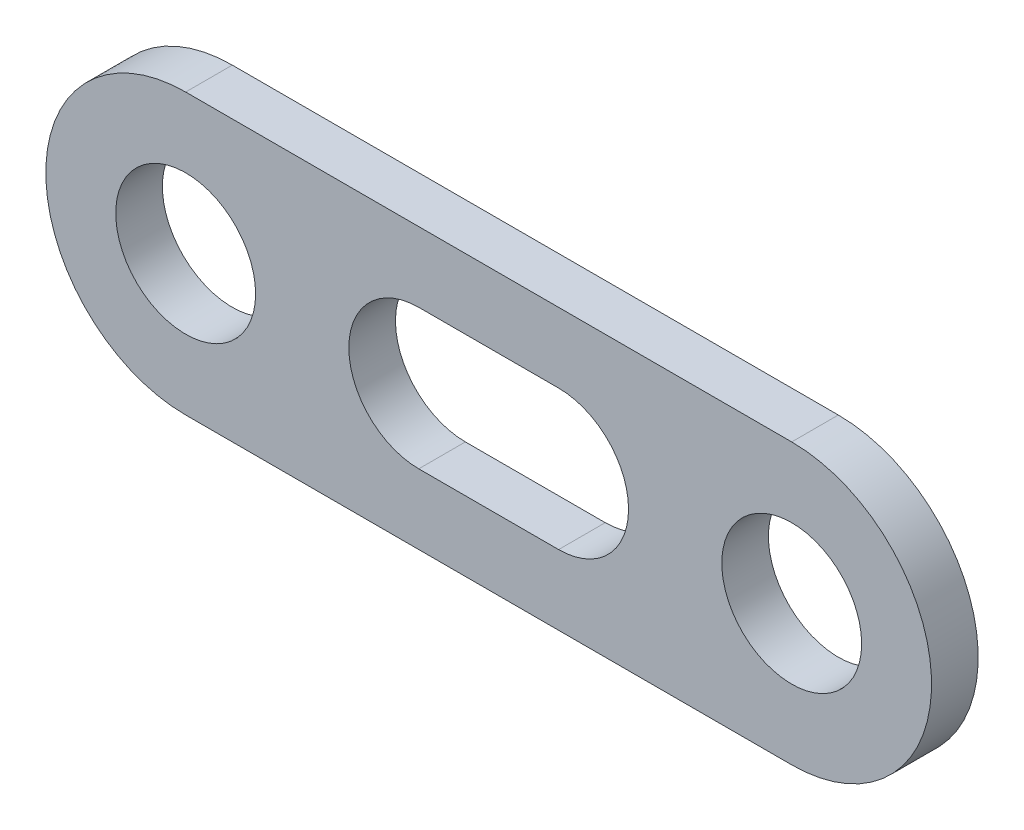
ISO-10303-21;
HEADER;
FILE_DESCRIPTION(('STEP AP214'),'2;1');
FILE_NAME('part.step','',(''),(''),'','','');
FILE_SCHEMA(('AUTOMOTIVE_DESIGN { 1 0 10303 214 1 1 1 1 }'));
ENDSEC;
DATA;
#1=APPLICATION_CONTEXT('core data for automotive mechanical design processes');
#2=APPLICATION_PROTOCOL_DEFINITION('international standard','automotive_design',2000,#1);
#3=PRODUCT_CONTEXT('',#1,'mechanical');
#4=PRODUCT('Part','Part','',(#3));
#5=PRODUCT_RELATED_PRODUCT_CATEGORY('part','',(#4));
#6=PRODUCT_DEFINITION_FORMATION('','',#4);
#7=PRODUCT_DEFINITION_CONTEXT('part definition',#1,'design');
#8=PRODUCT_DEFINITION('design','',#6,#7);
#9=PRODUCT_DEFINITION_SHAPE('','',#8);
#10=(LENGTH_UNIT() NAMED_UNIT(*) SI_UNIT(.MILLI.,.METRE.));
#11=(NAMED_UNIT(*) PLANE_ANGLE_UNIT() SI_UNIT($,.RADIAN.));
#12=(NAMED_UNIT(*) SI_UNIT($,.STERADIAN.) SOLID_ANGLE_UNIT());
#13=UNCERTAINTY_MEASURE_WITH_UNIT(LENGTH_MEASURE(1.E-05),#10,'distance_accuracy_value','');
#14=(GEOMETRIC_REPRESENTATION_CONTEXT(3) GLOBAL_UNCERTAINTY_ASSIGNED_CONTEXT((#13)) GLOBAL_UNIT_ASSIGNED_CONTEXT((#10,
#11,#12)) REPRESENTATION_CONTEXT('',''));
#15=CARTESIAN_POINT('',(0.,0.,0.));
#16=DIRECTION('',(0.,0.,1.));
#17=DIRECTION('',(1.,0.,0.));
#18=AXIS2_PLACEMENT_3D('',#15,#16,#17);
#19=CARTESIAN_POINT('',(0.,0.,2.));
#20=DIRECTION('',(0.,0.,1.));
#21=DIRECTION('',(1.,0.,0.));
#22=AXIS2_PLACEMENT_3D('',#19,#20,#21);
#23=PLANE('',#22);
#24=CARTESIAN_POINT('',(0.,0.,2.));
#25=DIRECTION('',(0.,0.,1.));
#26=DIRECTION('',(1.,0.,0.));
#27=AXIS2_PLACEMENT_3D('',#24,#25,#26);
#28=CIRCLE('',#27,3.);
#29=CARTESIAN_POINT('',(3.,0.,2.));
#30=VERTEX_POINT('',#29);
#31=EDGE_CURVE('E140',#30,#30,#28,.T.);
#32=ORIENTED_EDGE('',*,*,#31,.F.);
#33=EDGE_LOOP('',(#32));
#34=FACE_BOUND('',#33,.T.);
#35=CARTESIAN_POINT('',(0.,0.,2.));
#36=DIRECTION('',(0.,0.,1.));
#37=DIRECTION('',(1.,0.,0.));
#38=AXIS2_PLACEMENT_3D('',#35,#36,#37);
#39=CIRCLE('',#38,6.);
#40=CARTESIAN_POINT('',(0.,6.,2.));
#41=VERTEX_POINT('',#40);
#42=CARTESIAN_POINT('',(0.,-6.,2.));
#43=VERTEX_POINT('',#42);
#44=EDGE_CURVE('E146',#41,#43,#39,.T.);
#45=ORIENTED_EDGE('',*,*,#44,.T.);
#46=DIRECTION('',(1.,0.,0.));
#47=VECTOR('',#46,1.);
#48=CARTESIAN_POINT('',(0.,-6.,2.));
#49=LINE('',#48,#47);
#50=CARTESIAN_POINT('',(26.,-6.,2.));
#51=VERTEX_POINT('',#50);
#52=EDGE_CURVE('E149',#43,#51,#49,.T.);
#53=ORIENTED_EDGE('',*,*,#52,.T.);
#54=CARTESIAN_POINT('',(26.,0.,2.));
#55=DIRECTION('',(0.,0.,1.));
#56=DIRECTION('',(1.,0.,0.));
#57=AXIS2_PLACEMENT_3D('',#54,#55,#56);
#58=CIRCLE('',#57,6.);
#59=CARTESIAN_POINT('',(26.,6.,2.));
#60=VERTEX_POINT('',#59);
#61=EDGE_CURVE('E152',#51,#60,#58,.T.);
#62=ORIENTED_EDGE('',*,*,#61,.T.);
#63=DIRECTION('',(-1.,0.,0.));
#64=VECTOR('',#63,1.);
#65=CARTESIAN_POINT('',(0.,6.,2.));
#66=LINE('',#65,#64);
#67=EDGE_CURVE('E154',#60,#41,#66,.T.);
#68=ORIENTED_EDGE('',*,*,#67,.T.);
#69=EDGE_LOOP('',(#45,#53,#62,#68));
#70=FACE_BOUND('',#69,.T.);
#71=CARTESIAN_POINT('',(26.,0.,2.));
#72=DIRECTION('',(0.,0.,1.));
#73=DIRECTION('',(1.,0.,0.));
#74=AXIS2_PLACEMENT_3D('',#71,#72,#73);
#75=CIRCLE('',#74,3.);
#76=CARTESIAN_POINT('',(29.,0.,2.));
#77=VERTEX_POINT('',#76);
#78=EDGE_CURVE('E134',#77,#77,#75,.T.);
#79=ORIENTED_EDGE('',*,*,#78,.F.);
#80=EDGE_LOOP('',(#79));
#81=FACE_BOUND('',#80,.T.);
#82=DIRECTION('',(1.,0.,0.));
#83=VECTOR('',#82,1.);
#84=CARTESIAN_POINT('',(10.,-3.,2.));
#85=LINE('',#84,#83);
#86=CARTESIAN_POINT('',(10.,-3.,2.));
#87=VERTEX_POINT('',#86);
#88=CARTESIAN_POINT('',(16.,-2.99999999999999,2.));
#89=VERTEX_POINT('',#88);
#90=EDGE_CURVE('E106',#87,#89,#85,.T.);
#91=ORIENTED_EDGE('',*,*,#90,.F.);
#92=CARTESIAN_POINT('',(10.,0.,2.));
#93=DIRECTION('',(0.,0.,1.));
#94=DIRECTION('',(1.,0.,0.));
#95=AXIS2_PLACEMENT_3D('',#92,#93,#94);
#96=CIRCLE('',#95,3.);
#97=CARTESIAN_POINT('',(10.,3.,2.));
#98=VERTEX_POINT('',#97);
#99=EDGE_CURVE('E98',#98,#87,#96,.T.);
#100=ORIENTED_EDGE('',*,*,#99,.F.);
#101=DIRECTION('',(-1.,0.,0.));
#102=VECTOR('',#101,1.);
#103=CARTESIAN_POINT('',(10.,3.,2.));
#104=LINE('',#103,#102);
#105=CARTESIAN_POINT('',(16.,2.99999999999999,2.));
#106=VERTEX_POINT('',#105);
#107=EDGE_CURVE('E120',#106,#98,#104,.T.);
#108=ORIENTED_EDGE('',*,*,#107,.F.);
#109=CARTESIAN_POINT('',(16.,0.,2.));
#110=DIRECTION('',(0.,0.,1.));
#111=DIRECTION('',(1.,0.,0.));
#112=AXIS2_PLACEMENT_3D('',#109,#110,#111);
#113=CIRCLE('',#112,2.99999999999999);
#114=EDGE_CURVE('E118',#89,#106,#113,.T.);
#115=ORIENTED_EDGE('',*,*,#114,.F.);
#116=EDGE_LOOP('',(#91,#100,#108,#115));
#117=FACE_BOUND('',#116,.T.);
#118=ADVANCED_FACE('F33',(#34,#70,#81,#117),#23,.T.);
#119=CARTESIAN_POINT('',(0.,0.,0.));
#120=DIRECTION('',(0.,0.,1.));
#121=DIRECTION('',(1.,0.,0.));
#122=AXIS2_PLACEMENT_3D('',#119,#120,#121);
#123=PLANE('',#122);
#124=CARTESIAN_POINT('',(26.,0.,0.));
#125=DIRECTION('',(0.,0.,1.));
#126=DIRECTION('',(1.,0.,0.));
#127=AXIS2_PLACEMENT_3D('',#124,#125,#126);
#128=CIRCLE('',#127,3.);
#129=CARTESIAN_POINT('',(29.,0.,0.));
#130=VERTEX_POINT('',#129);
#131=EDGE_CURVE('E114',#130,#130,#128,.T.);
#132=ORIENTED_EDGE('',*,*,#131,.T.);
#133=EDGE_LOOP('',(#132));
#134=FACE_BOUND('',#133,.T.);
#135=CARTESIAN_POINT('',(0.,0.,0.));
#136=DIRECTION('',(0.,0.,1.));
#137=DIRECTION('',(1.,0.,0.));
#138=AXIS2_PLACEMENT_3D('',#135,#136,#137);
#139=CIRCLE('',#138,3.);
#140=CARTESIAN_POINT('',(3.,0.,0.));
#141=VERTEX_POINT('',#140);
#142=EDGE_CURVE('E137',#141,#141,#139,.T.);
#143=ORIENTED_EDGE('',*,*,#142,.T.);
#144=EDGE_LOOP('',(#143));
#145=FACE_BOUND('',#144,.T.);
#146=CARTESIAN_POINT('',(0.,0.,0.));
#147=DIRECTION('',(0.,0.,1.));
#148=DIRECTION('',(1.,0.,0.));
#149=AXIS2_PLACEMENT_3D('',#146,#147,#148);
#150=CIRCLE('',#149,6.);
#151=CARTESIAN_POINT('',(0.,6.,0.));
#152=VERTEX_POINT('',#151);
#153=CARTESIAN_POINT('',(0.,-6.,0.));
#154=VERTEX_POINT('',#153);
#155=EDGE_CURVE('E143',#152,#154,#150,.T.);
#156=ORIENTED_EDGE('',*,*,#155,.F.);
#157=DIRECTION('',(-1.,0.,0.));
#158=VECTOR('',#157,1.);
#159=CARTESIAN_POINT('',(0.,6.,0.));
#160=LINE('',#159,#158);
#161=CARTESIAN_POINT('',(26.,6.,0.));
#162=VERTEX_POINT('',#161);
#163=EDGE_CURVE('E150',#162,#152,#160,.T.);
#164=ORIENTED_EDGE('',*,*,#163,.F.);
#165=CARTESIAN_POINT('',(26.,0.,0.));
#166=DIRECTION('',(0.,0.,1.));
#167=DIRECTION('',(1.,0.,0.));
#168=AXIS2_PLACEMENT_3D('',#165,#166,#167);
#169=CIRCLE('',#168,6.);
#170=CARTESIAN_POINT('',(26.,-6.,0.));
#171=VERTEX_POINT('',#170);
#172=EDGE_CURVE('E161',#171,#162,#169,.T.);
#173=ORIENTED_EDGE('',*,*,#172,.F.);
#174=DIRECTION('',(1.,0.,0.));
#175=VECTOR('',#174,1.);
#176=CARTESIAN_POINT('',(0.,-6.,0.));
#177=LINE('',#176,#175);
#178=EDGE_CURVE('E159',#154,#171,#177,.T.);
#179=ORIENTED_EDGE('',*,*,#178,.F.);
#180=EDGE_LOOP('',(#156,#164,#173,#179));
#181=FACE_BOUND('',#180,.T.);
#182=CARTESIAN_POINT('',(10.,0.,0.));
#183=DIRECTION('',(0.,0.,1.));
#184=DIRECTION('',(1.,0.,0.));
#185=AXIS2_PLACEMENT_3D('',#182,#183,#184);
#186=CIRCLE('',#185,3.);
#187=CARTESIAN_POINT('',(10.,3.,0.));
#188=VERTEX_POINT('',#187);
#189=CARTESIAN_POINT('',(10.,-3.,0.));
#190=VERTEX_POINT('',#189);
#191=EDGE_CURVE('E56',#188,#190,#186,.T.);
#192=ORIENTED_EDGE('',*,*,#191,.T.);
#193=DIRECTION('',(1.,0.,0.));
#194=VECTOR('',#193,1.);
#195=CARTESIAN_POINT('',(10.,-3.,0.));
#196=LINE('',#195,#194);
#197=CARTESIAN_POINT('',(16.,-2.99999999999999,0.));
#198=VERTEX_POINT('',#197);
#199=EDGE_CURVE('E113',#190,#198,#196,.T.);
#200=ORIENTED_EDGE('',*,*,#199,.T.);
#201=CARTESIAN_POINT('',(16.,0.,0.));
#202=DIRECTION('',(0.,0.,1.));
#203=DIRECTION('',(1.,0.,0.));
#204=AXIS2_PLACEMENT_3D('',#201,#202,#203);
#205=CIRCLE('',#204,2.99999999999999);
#206=CARTESIAN_POINT('',(16.,2.99999999999999,0.));
#207=VERTEX_POINT('',#206);
#208=EDGE_CURVE('E126',#198,#207,#205,.T.);
#209=ORIENTED_EDGE('',*,*,#208,.T.);
#210=DIRECTION('',(-1.,0.,0.));
#211=VECTOR('',#210,1.);
#212=CARTESIAN_POINT('',(10.,3.,0.));
#213=LINE('',#212,#211);
#214=EDGE_CURVE('E107',#207,#188,#213,.T.);
#215=ORIENTED_EDGE('',*,*,#214,.T.);
#216=EDGE_LOOP('',(#192,#200,#209,#215));
#217=FACE_BOUND('',#216,.T.);
#218=ADVANCED_FACE('F179',(#134,#145,#181,#217),#123,.F.);
#219=CARTESIAN_POINT('',(0.,0.,2.));
#220=DIRECTION('',(0.,0.,-1.));
#221=DIRECTION('',(-1.,0.,0.));
#222=AXIS2_PLACEMENT_3D('',#219,#220,#221);
#223=CYLINDRICAL_SURFACE('',#222,6.);
#224=ORIENTED_EDGE('',*,*,#155,.T.);
#225=DIRECTION('',(0.,0.,-1.));
#226=VECTOR('',#225,1.);
#227=CARTESIAN_POINT('',(0.,-6.,2.));
#228=LINE('',#227,#226);
#229=EDGE_CURVE('E11',#43,#154,#228,.T.);
#230=ORIENTED_EDGE('',*,*,#229,.F.);
#231=ORIENTED_EDGE('',*,*,#44,.F.);
#232=DIRECTION('',(0.,0.,-1.));
#233=VECTOR('',#232,1.);
#234=CARTESIAN_POINT('',(0.,6.,2.));
#235=LINE('',#234,#233);
#236=EDGE_CURVE('E156',#41,#152,#235,.T.);
#237=ORIENTED_EDGE('',*,*,#236,.T.);
#238=EDGE_LOOP('',(#224,#230,#231,#237));
#239=FACE_BOUND('',#238,.T.);
#240=ADVANCED_FACE('F35',(#239),#223,.T.);
#241=CARTESIAN_POINT('',(0.,-6.,2.));
#242=DIRECTION('',(0.,1.,0.));
#243=DIRECTION('',(-1.,0.,0.));
#244=AXIS2_PLACEMENT_3D('',#241,#242,#243);
#245=PLANE('',#244);
#246=ORIENTED_EDGE('',*,*,#178,.T.);
#247=DIRECTION('',(0.,0.,-1.));
#248=VECTOR('',#247,1.);
#249=CARTESIAN_POINT('',(26.,-6.,2.));
#250=LINE('',#249,#248);
#251=EDGE_CURVE('E41',#51,#171,#250,.T.);
#252=ORIENTED_EDGE('',*,*,#251,.F.);
#253=ORIENTED_EDGE('',*,*,#52,.F.);
#254=ORIENTED_EDGE('',*,*,#229,.T.);
#255=EDGE_LOOP('',(#246,#252,#253,#254));
#256=FACE_BOUND('',#255,.T.);
#257=ADVANCED_FACE('F190',(#256),#245,.F.);
#258=CARTESIAN_POINT('',(26.,0.,2.));
#259=DIRECTION('',(0.,0.,-1.));
#260=DIRECTION('',(-1.,0.,0.));
#261=AXIS2_PLACEMENT_3D('',#258,#259,#260);
#262=CYLINDRICAL_SURFACE('',#261,6.);
#263=ORIENTED_EDGE('',*,*,#172,.T.);
#264=DIRECTION('',(0.,0.,-1.));
#265=VECTOR('',#264,1.);
#266=CARTESIAN_POINT('',(26.,6.,2.));
#267=LINE('',#266,#265);
#268=EDGE_CURVE('E166',#60,#162,#267,.T.);
#269=ORIENTED_EDGE('',*,*,#268,.F.);
#270=ORIENTED_EDGE('',*,*,#61,.F.);
#271=ORIENTED_EDGE('',*,*,#251,.T.);
#272=EDGE_LOOP('',(#263,#269,#270,#271));
#273=FACE_BOUND('',#272,.T.);
#274=ADVANCED_FACE('F173',(#273),#262,.T.);
#275=CARTESIAN_POINT('',(0.,6.,2.));
#276=DIRECTION('',(0.,-1.,0.));
#277=DIRECTION('',(1.,0.,0.));
#278=AXIS2_PLACEMENT_3D('',#275,#276,#277);
#279=PLANE('',#278);
#280=ORIENTED_EDGE('',*,*,#163,.T.);
#281=ORIENTED_EDGE('',*,*,#236,.F.);
#282=ORIENTED_EDGE('',*,*,#67,.F.);
#283=ORIENTED_EDGE('',*,*,#268,.T.);
#284=EDGE_LOOP('',(#280,#281,#282,#283));
#285=FACE_BOUND('',#284,.T.);
#286=ADVANCED_FACE('F183',(#285),#279,.F.);
#287=CARTESIAN_POINT('',(0.,0.,2.));
#288=DIRECTION('',(0.,0.,-1.));
#289=DIRECTION('',(-1.,0.,0.));
#290=AXIS2_PLACEMENT_3D('',#287,#288,#289);
#291=CYLINDRICAL_SURFACE('',#290,3.);
#292=ORIENTED_EDGE('',*,*,#31,.T.);
#293=EDGE_LOOP('',(#292));
#294=FACE_BOUND('',#293,.T.);
#295=ORIENTED_EDGE('',*,*,#142,.F.);
#296=EDGE_LOOP('',(#295));
#297=FACE_BOUND('',#296,.T.);
#298=ADVANCED_FACE('F207',(#294,#297),#291,.F.);
#299=CARTESIAN_POINT('',(26.,0.,2.));
#300=DIRECTION('',(0.,0.,-1.));
#301=DIRECTION('',(-1.,0.,0.));
#302=AXIS2_PLACEMENT_3D('',#299,#300,#301);
#303=CYLINDRICAL_SURFACE('',#302,3.);
#304=ORIENTED_EDGE('',*,*,#78,.T.);
#305=EDGE_LOOP('',(#304));
#306=FACE_BOUND('',#305,.T.);
#307=ORIENTED_EDGE('',*,*,#131,.F.);
#308=EDGE_LOOP('',(#307));
#309=FACE_BOUND('',#308,.T.);
#310=ADVANCED_FACE('F214',(#306,#309),#303,.F.);
#311=CARTESIAN_POINT('',(10.,0.,2.));
#312=DIRECTION('',(0.,0.,-1.));
#313=DIRECTION('',(-1.,0.,0.));
#314=AXIS2_PLACEMENT_3D('',#311,#312,#313);
#315=CYLINDRICAL_SURFACE('',#314,3.);
#316=ORIENTED_EDGE('',*,*,#191,.F.);
#317=DIRECTION('',(0.,0.,-1.));
#318=VECTOR('',#317,1.);
#319=CARTESIAN_POINT('',(10.,3.,2.));
#320=LINE('',#319,#318);
#321=EDGE_CURVE('E102',#98,#188,#320,.T.);
#322=ORIENTED_EDGE('',*,*,#321,.F.);
#323=ORIENTED_EDGE('',*,*,#99,.T.);
#324=DIRECTION('',(0.,0.,-1.));
#325=VECTOR('',#324,1.);
#326=CARTESIAN_POINT('',(10.,-3.,2.));
#327=LINE('',#326,#325);
#328=EDGE_CURVE('E101',#87,#190,#327,.T.);
#329=ORIENTED_EDGE('',*,*,#328,.T.);
#330=EDGE_LOOP('',(#316,#322,#323,#329));
#331=FACE_BOUND('',#330,.T.);
#332=ADVANCED_FACE('F100',(#331),#315,.F.);
#333=CARTESIAN_POINT('',(10.,-3.,2.));
#334=DIRECTION('',(0.,1.,0.));
#335=DIRECTION('',(-1.,0.,0.));
#336=AXIS2_PLACEMENT_3D('',#333,#334,#335);
#337=PLANE('',#336);
#338=ORIENTED_EDGE('',*,*,#199,.F.);
#339=ORIENTED_EDGE('',*,*,#328,.F.);
#340=ORIENTED_EDGE('',*,*,#90,.T.);
#341=DIRECTION('',(0.,0.,-1.));
#342=VECTOR('',#341,1.);
#343=CARTESIAN_POINT('',(16.,-2.99999999999999,2.));
#344=LINE('',#343,#342);
#345=EDGE_CURVE('E115',#89,#198,#344,.T.);
#346=ORIENTED_EDGE('',*,*,#345,.T.);
#347=EDGE_LOOP('',(#338,#339,#340,#346));
#348=FACE_BOUND('',#347,.T.);
#349=ADVANCED_FACE('F110',(#348),#337,.T.);
#350=CARTESIAN_POINT('',(16.,0.,2.));
#351=DIRECTION('',(0.,0.,-1.));
#352=DIRECTION('',(-1.,0.,0.));
#353=AXIS2_PLACEMENT_3D('',#350,#351,#352);
#354=CYLINDRICAL_SURFACE('',#353,2.99999999999999);
#355=ORIENTED_EDGE('',*,*,#208,.F.);
#356=ORIENTED_EDGE('',*,*,#345,.F.);
#357=ORIENTED_EDGE('',*,*,#114,.T.);
#358=DIRECTION('',(0.,0.,-1.));
#359=VECTOR('',#358,1.);
#360=CARTESIAN_POINT('',(16.,2.99999999999999,2.));
#361=LINE('',#360,#359);
#362=EDGE_CURVE('E48',#106,#207,#361,.T.);
#363=ORIENTED_EDGE('',*,*,#362,.T.);
#364=EDGE_LOOP('',(#355,#356,#357,#363));
#365=FACE_BOUND('',#364,.T.);
#366=ADVANCED_FACE('F231',(#365),#354,.F.);
#367=CARTESIAN_POINT('',(10.,3.,2.));
#368=DIRECTION('',(0.,-1.,0.));
#369=DIRECTION('',(1.,0.,0.));
#370=AXIS2_PLACEMENT_3D('',#367,#368,#369);
#371=PLANE('',#370);
#372=ORIENTED_EDGE('',*,*,#214,.F.);
#373=ORIENTED_EDGE('',*,*,#362,.F.);
#374=ORIENTED_EDGE('',*,*,#107,.T.);
#375=ORIENTED_EDGE('',*,*,#321,.T.);
#376=EDGE_LOOP('',(#372,#373,#374,#375));
#377=FACE_BOUND('',#376,.T.);
#378=ADVANCED_FACE('F234',(#377),#371,.T.);
#379=CLOSED_SHELL('',(#118,#218,#240,#257,#274,#286,#298,#310,#332,#349,#366,#378));
#380=MANIFOLD_SOLID_BREP('B2',#379);
#381=ADVANCED_BREP_SHAPE_REPRESENTATION('',(#18,#380),#14);
#382=SHAPE_DEFINITION_REPRESENTATION(#9,#381);
ENDSEC;
END-ISO-10303-21;
